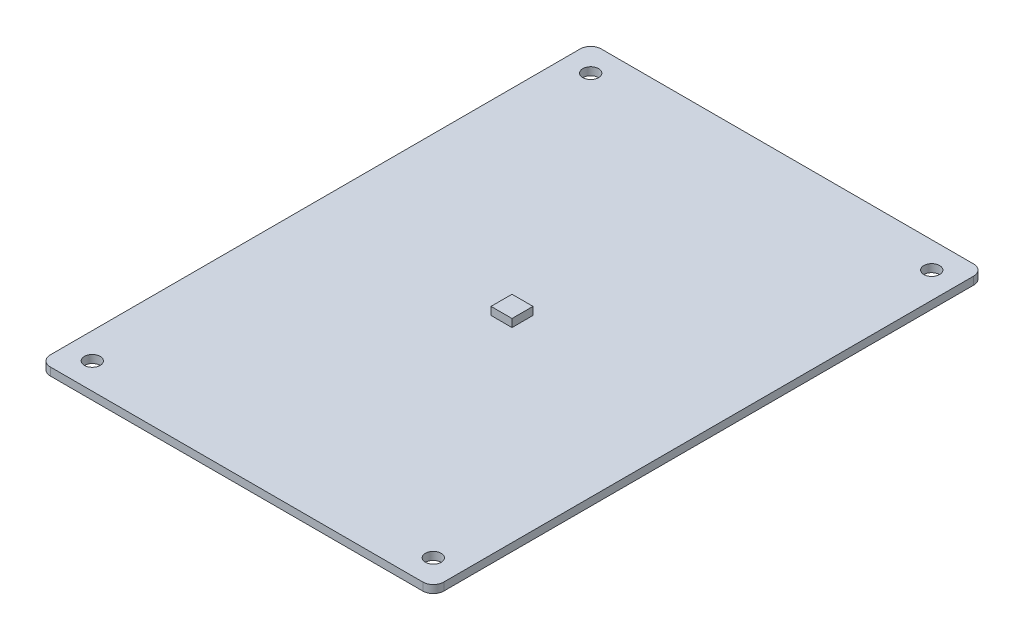
ISO-10303-21;
HEADER;
FILE_DESCRIPTION(('STEP AP214'),'2;1');
FILE_NAME('part.step','',(''),(''),'','','');
FILE_SCHEMA(('AUTOMOTIVE_DESIGN { 1 0 10303 214 1 1 1 1 }'));
ENDSEC;
DATA;
#1=APPLICATION_CONTEXT('core data for automotive mechanical design processes');
#2=APPLICATION_PROTOCOL_DEFINITION('international standard','automotive_design',2000,#1);
#3=PRODUCT_CONTEXT('',#1,'mechanical');
#4=PRODUCT('Part','Part','',(#3));
#5=PRODUCT_RELATED_PRODUCT_CATEGORY('part','',(#4));
#6=PRODUCT_DEFINITION_FORMATION('','',#4);
#7=PRODUCT_DEFINITION_CONTEXT('part definition',#1,'design');
#8=PRODUCT_DEFINITION('design','',#6,#7);
#9=PRODUCT_DEFINITION_SHAPE('','',#8);
#10=(LENGTH_UNIT() NAMED_UNIT(*) SI_UNIT(.MILLI.,.METRE.));
#11=(NAMED_UNIT(*) PLANE_ANGLE_UNIT() SI_UNIT($,.RADIAN.));
#12=(NAMED_UNIT(*) SI_UNIT($,.STERADIAN.) SOLID_ANGLE_UNIT());
#13=UNCERTAINTY_MEASURE_WITH_UNIT(LENGTH_MEASURE(1.E-05),#10,'distance_accuracy_value','');
#14=(GEOMETRIC_REPRESENTATION_CONTEXT(3) GLOBAL_UNCERTAINTY_ASSIGNED_CONTEXT((#13)) GLOBAL_UNIT_ASSIGNED_CONTEXT((#10,
#11,#12)) REPRESENTATION_CONTEXT('',''));
#15=CARTESIAN_POINT('',(0.,0.,0.));
#16=DIRECTION('',(0.,0.,1.));
#17=DIRECTION('',(1.,0.,0.));
#18=AXIS2_PLACEMENT_3D('',#15,#16,#17);
#19=CARTESIAN_POINT('',(41.5141509433962,1.5,20.0400943396226));
#20=DIRECTION('',(0.,1.,0.));
#21=DIRECTION('',(0.,0.,1.));
#22=AXIS2_PLACEMENT_3D('',#19,#20,#21);
#23=PLANE('',#22);
#24=CARTESIAN_POINT('',(-26.4858490566038,1.5,17.0400943396226));
#25=DIRECTION('',(0.,1.,0.));
#26=DIRECTION('',(0.,0.,1.));
#27=AXIS2_PLACEMENT_3D('',#24,#25,#26);
#28=CIRCLE('',#27,1.5);
#29=CARTESIAN_POINT('',(-26.4858490566038,1.5,18.5400943396226));
#30=VERTEX_POINT('',#29);
#31=EDGE_CURVE('E201',#30,#30,#28,.T.);
#32=ORIENTED_EDGE('',*,*,#31,.F.);
#33=EDGE_LOOP('',(#32));
#34=FACE_BOUND('',#33,.T.);
#35=CARTESIAN_POINT('',(38.5141509433962,1.5,-77.9599056603774));
#36=DIRECTION('',(0.,1.,0.));
#37=DIRECTION('',(0.,0.,1.));
#38=AXIS2_PLACEMENT_3D('',#35,#36,#37);
#39=CIRCLE('',#38,1.5);
#40=CARTESIAN_POINT('',(38.5141509433962,1.5,-76.4599056603774));
#41=VERTEX_POINT('',#40);
#42=EDGE_CURVE('E146',#41,#41,#39,.T.);
#43=ORIENTED_EDGE('',*,*,#42,.F.);
#44=EDGE_LOOP('',(#43));
#45=FACE_BOUND('',#44,.T.);
#46=CARTESIAN_POINT('',(41.5141509433962,1.5,20.0400943396226));
#47=DIRECTION('',(0.,1.,0.));
#48=DIRECTION('',(0.,0.,1.));
#49=AXIS2_PLACEMENT_3D('',#46,#47,#48);
#50=CIRCLE('',#49,2.);
#51=CARTESIAN_POINT('',(41.5141509433962,1.5,22.0400943396226));
#52=VERTEX_POINT('',#51);
#53=CARTESIAN_POINT('',(43.5141509433962,1.5,20.0400943396226));
#54=VERTEX_POINT('',#53);
#55=EDGE_CURVE('E158',#52,#54,#50,.T.);
#56=ORIENTED_EDGE('',*,*,#55,.T.);
#57=DIRECTION('',(0.,0.,-1.));
#58=VECTOR('',#57,1.);
#59=CARTESIAN_POINT('',(43.5141509433962,1.5,-80.9599056603774));
#60=LINE('',#59,#58);
#61=CARTESIAN_POINT('',(43.5141509433962,1.5,-80.9599056603774));
#62=VERTEX_POINT('',#61);
#63=EDGE_CURVE('E98',#54,#62,#60,.T.);
#64=ORIENTED_EDGE('',*,*,#63,.T.);
#65=CARTESIAN_POINT('',(41.5141509433962,1.5,-80.9599056603774));
#66=DIRECTION('',(0.,1.,0.));
#67=DIRECTION('',(0.,0.,-1.));
#68=AXIS2_PLACEMENT_3D('',#65,#66,#67);
#69=CIRCLE('',#68,2.);
#70=CARTESIAN_POINT('',(41.5141509433962,1.5,-82.9599056603774));
#71=VERTEX_POINT('',#70);
#72=EDGE_CURVE('E173',#62,#71,#69,.T.);
#73=ORIENTED_EDGE('',*,*,#72,.T.);
#74=DIRECTION('',(-1.,0.,0.));
#75=VECTOR('',#74,1.);
#76=CARTESIAN_POINT('',(-29.4858490566038,1.5,-82.9599056603774));
#77=LINE('',#76,#75);
#78=CARTESIAN_POINT('',(-29.4858490566038,1.5,-82.9599056603774));
#79=VERTEX_POINT('',#78);
#80=EDGE_CURVE('E186',#71,#79,#77,.T.);
#81=ORIENTED_EDGE('',*,*,#80,.T.);
#82=CARTESIAN_POINT('',(-29.4858490566038,1.5,-80.9599056603774));
#83=DIRECTION('',(0.,1.,0.));
#84=DIRECTION('',(0.,0.,1.));
#85=AXIS2_PLACEMENT_3D('',#82,#83,#84);
#86=CIRCLE('',#85,2.);
#87=CARTESIAN_POINT('',(-31.4858490566038,1.5,-80.9599056603774));
#88=VERTEX_POINT('',#87);
#89=EDGE_CURVE('E121',#79,#88,#86,.T.);
#90=ORIENTED_EDGE('',*,*,#89,.T.);
#91=DIRECTION('',(0.,0.,1.));
#92=VECTOR('',#91,1.);
#93=CARTESIAN_POINT('',(-31.4858490566038,1.5,-80.9599056603774));
#94=LINE('',#93,#92);
#95=CARTESIAN_POINT('',(-31.4858490566038,1.5,20.0400943396226));
#96=VERTEX_POINT('',#95);
#97=EDGE_CURVE('E114',#88,#96,#94,.T.);
#98=ORIENTED_EDGE('',*,*,#97,.T.);
#99=CARTESIAN_POINT('',(-29.4858490566038,1.5,20.0400943396226));
#100=DIRECTION('',(0.,1.,0.));
#101=DIRECTION('',(0.,0.,1.));
#102=AXIS2_PLACEMENT_3D('',#99,#100,#101);
#103=CIRCLE('',#102,2.);
#104=CARTESIAN_POINT('',(-29.4858490566038,1.5,22.0400943396226));
#105=VERTEX_POINT('',#104);
#106=EDGE_CURVE('E118',#96,#105,#103,.T.);
#107=ORIENTED_EDGE('',*,*,#106,.T.);
#108=DIRECTION('',(1.,0.,0.));
#109=VECTOR('',#108,1.);
#110=CARTESIAN_POINT('',(-29.4858490566038,1.5,22.0400943396226));
#111=LINE('',#110,#109);
#112=EDGE_CURVE('E57',#105,#52,#111,.T.);
#113=ORIENTED_EDGE('',*,*,#112,.T.);
#114=EDGE_LOOP('',(#56,#64,#73,#81,#90,#98,#107,#113));
#115=FACE_BOUND('',#114,.T.);
#116=CARTESIAN_POINT('',(38.5141509433962,1.5,17.0400943396226));
#117=DIRECTION('',(0.,1.,0.));
#118=DIRECTION('',(0.,0.,1.));
#119=AXIS2_PLACEMENT_3D('',#116,#117,#118);
#120=CIRCLE('',#119,1.5);
#121=CARTESIAN_POINT('',(38.5141509433962,1.5,18.5400943396226));
#122=VERTEX_POINT('',#121);
#123=EDGE_CURVE('E195',#122,#122,#120,.T.);
#124=ORIENTED_EDGE('',*,*,#123,.F.);
#125=EDGE_LOOP('',(#124));
#126=FACE_BOUND('',#125,.T.);
#127=CARTESIAN_POINT('',(-26.4858490566038,1.5,-77.9599056603774));
#128=DIRECTION('',(0.,1.,0.));
#129=DIRECTION('',(0.,0.,1.));
#130=AXIS2_PLACEMENT_3D('',#127,#128,#129);
#131=CIRCLE('',#130,1.5);
#132=CARTESIAN_POINT('',(-26.4858490566038,1.5,-76.4599056603774));
#133=VERTEX_POINT('',#132);
#134=EDGE_CURVE('E207',#133,#133,#131,.T.);
#135=ORIENTED_EDGE('',*,*,#134,.F.);
#136=EDGE_LOOP('',(#135));
#137=FACE_BOUND('',#136,.T.);
#138=DIRECTION('',(-1.,0.,0.));
#139=VECTOR('',#138,1.);
#140=CARTESIAN_POINT('',(4.01415094339619,1.5,-32.4599056603774));
#141=LINE('',#140,#139);
#142=CARTESIAN_POINT('',(8.01415094339619,1.5,-32.4599056603774));
#143=VERTEX_POINT('',#142);
#144=CARTESIAN_POINT('',(4.01415094339619,1.5,-32.4599056603774));
#145=VERTEX_POINT('',#144);
#146=EDGE_CURVE('E231',#143,#145,#141,.T.);
#147=ORIENTED_EDGE('',*,*,#146,.F.);
#148=DIRECTION('',(0.,0.,-1.));
#149=VECTOR('',#148,1.);
#150=CARTESIAN_POINT('',(8.01415094339619,1.5,-28.4599056603774));
#151=LINE('',#150,#149);
#152=CARTESIAN_POINT('',(8.01415094339619,1.5,-28.4599056603774));
#153=VERTEX_POINT('',#152);
#154=EDGE_CURVE('E234',#153,#143,#151,.T.);
#155=ORIENTED_EDGE('',*,*,#154,.F.);
#156=DIRECTION('',(1.,0.,0.));
#157=VECTOR('',#156,1.);
#158=CARTESIAN_POINT('',(4.01415094339619,1.5,-28.4599056603774));
#159=LINE('',#158,#157);
#160=CARTESIAN_POINT('',(4.0141509433962,1.5,-28.4599056603774));
#161=VERTEX_POINT('',#160);
#162=EDGE_CURVE('E226',#161,#153,#159,.T.);
#163=ORIENTED_EDGE('',*,*,#162,.F.);
#164=DIRECTION('',(0.,0.,1.));
#165=VECTOR('',#164,1.);
#166=CARTESIAN_POINT('',(4.01415094339619,1.5,-28.4599056603774));
#167=LINE('',#166,#165);
#168=EDGE_CURVE('E229',#145,#161,#167,.T.);
#169=ORIENTED_EDGE('',*,*,#168,.F.);
#170=EDGE_LOOP('',(#147,#155,#163,#169));
#171=FACE_BOUND('',#170,.T.);
#172=ADVANCED_FACE('F33',(#34,#45,#115,#126,#137,#171),#23,.T.);
#173=CARTESIAN_POINT('',(41.5141509433962,0.,20.0400943396226));
#174=DIRECTION('',(0.,1.,0.));
#175=DIRECTION('',(0.,0.,1.));
#176=AXIS2_PLACEMENT_3D('',#173,#174,#175);
#177=PLANE('',#176);
#178=CARTESIAN_POINT('',(41.5141509433962,0.,20.0400943396226));
#179=DIRECTION('',(0.,1.,0.));
#180=DIRECTION('',(0.,0.,1.));
#181=AXIS2_PLACEMENT_3D('',#178,#179,#180);
#182=CIRCLE('',#181,2.);
#183=CARTESIAN_POINT('',(41.5141509433962,0.,22.0400943396226));
#184=VERTEX_POINT('',#183);
#185=CARTESIAN_POINT('',(43.5141509433962,0.,20.0400943396226));
#186=VERTEX_POINT('',#185);
#187=EDGE_CURVE('E142',#184,#186,#182,.T.);
#188=ORIENTED_EDGE('',*,*,#187,.F.);
#189=DIRECTION('',(1.,0.,0.));
#190=VECTOR('',#189,1.);
#191=CARTESIAN_POINT('',(-29.4858490566038,0.,22.0400943396226));
#192=LINE('',#191,#190);
#193=CARTESIAN_POINT('',(-29.4858490566038,0.,22.0400943396226));
#194=VERTEX_POINT('',#193);
#195=EDGE_CURVE('E90',#194,#184,#192,.T.);
#196=ORIENTED_EDGE('',*,*,#195,.F.);
#197=CARTESIAN_POINT('',(-29.4858490566038,0.,20.0400943396226));
#198=DIRECTION('',(0.,1.,0.));
#199=DIRECTION('',(0.,0.,1.));
#200=AXIS2_PLACEMENT_3D('',#197,#198,#199);
#201=CIRCLE('',#200,2.);
#202=CARTESIAN_POINT('',(-31.4858490566038,0.,20.0400943396226));
#203=VERTEX_POINT('',#202);
#204=EDGE_CURVE('E155',#203,#194,#201,.T.);
#205=ORIENTED_EDGE('',*,*,#204,.F.);
#206=DIRECTION('',(0.,0.,1.));
#207=VECTOR('',#206,1.);
#208=CARTESIAN_POINT('',(-31.4858490566038,0.,-80.9599056603774));
#209=LINE('',#208,#207);
#210=CARTESIAN_POINT('',(-31.4858490566038,0.,-80.9599056603774));
#211=VERTEX_POINT('',#210);
#212=EDGE_CURVE('E130',#211,#203,#209,.T.);
#213=ORIENTED_EDGE('',*,*,#212,.F.);
#214=CARTESIAN_POINT('',(-29.4858490566038,0.,-80.9599056603774));
#215=DIRECTION('',(0.,1.,0.));
#216=DIRECTION('',(0.,0.,1.));
#217=AXIS2_PLACEMENT_3D('',#214,#215,#216);
#218=CIRCLE('',#217,2.);
#219=CARTESIAN_POINT('',(-29.4858490566038,0.,-82.9599056603774));
#220=VERTEX_POINT('',#219);
#221=EDGE_CURVE('E152',#220,#211,#218,.T.);
#222=ORIENTED_EDGE('',*,*,#221,.F.);
#223=DIRECTION('',(-1.,0.,0.));
#224=VECTOR('',#223,1.);
#225=CARTESIAN_POINT('',(-29.4858490566038,0.,-82.9599056603774));
#226=LINE('',#225,#224);
#227=CARTESIAN_POINT('',(41.5141509433962,0.,-82.9599056603774));
#228=VERTEX_POINT('',#227);
#229=EDGE_CURVE('E150',#228,#220,#226,.T.);
#230=ORIENTED_EDGE('',*,*,#229,.F.);
#231=CARTESIAN_POINT('',(41.5141509433962,0.,-80.9599056603774));
#232=DIRECTION('',(0.,1.,0.));
#233=DIRECTION('',(0.,0.,-1.));
#234=AXIS2_PLACEMENT_3D('',#231,#232,#233);
#235=CIRCLE('',#234,2.);
#236=CARTESIAN_POINT('',(43.5141509433962,0.,-80.9599056603774));
#237=VERTEX_POINT('',#236);
#238=EDGE_CURVE('E148',#237,#228,#235,.T.);
#239=ORIENTED_EDGE('',*,*,#238,.F.);
#240=DIRECTION('',(0.,0.,-1.));
#241=VECTOR('',#240,1.);
#242=CARTESIAN_POINT('',(43.5141509433962,0.,-80.9599056603774));
#243=LINE('',#242,#241);
#244=EDGE_CURVE('E145',#186,#237,#243,.T.);
#245=ORIENTED_EDGE('',*,*,#244,.F.);
#246=EDGE_LOOP('',(#188,#196,#205,#213,#222,#230,#239,#245));
#247=FACE_BOUND('',#246,.T.);
#248=CARTESIAN_POINT('',(38.5141509433962,0.,-77.9599056603774));
#249=DIRECTION('',(0.,1.,0.));
#250=DIRECTION('',(0.,0.,1.));
#251=AXIS2_PLACEMENT_3D('',#248,#249,#250);
#252=CIRCLE('',#251,1.5);
#253=CARTESIAN_POINT('',(38.5141509433962,0.,-76.4599056603774));
#254=VERTEX_POINT('',#253);
#255=EDGE_CURVE('E192',#254,#254,#252,.T.);
#256=ORIENTED_EDGE('',*,*,#255,.T.);
#257=EDGE_LOOP('',(#256));
#258=FACE_BOUND('',#257,.T.);
#259=CARTESIAN_POINT('',(38.5141509433962,0.,17.0400943396226));
#260=DIRECTION('',(0.,1.,0.));
#261=DIRECTION('',(0.,0.,1.));
#262=AXIS2_PLACEMENT_3D('',#259,#260,#261);
#263=CIRCLE('',#262,1.5);
#264=CARTESIAN_POINT('',(38.5141509433962,0.,18.5400943396226));
#265=VERTEX_POINT('',#264);
#266=EDGE_CURVE('E198',#265,#265,#263,.T.);
#267=ORIENTED_EDGE('',*,*,#266,.T.);
#268=EDGE_LOOP('',(#267));
#269=FACE_BOUND('',#268,.T.);
#270=CARTESIAN_POINT('',(-26.4858490566038,0.,17.0400943396226));
#271=DIRECTION('',(0.,1.,0.));
#272=DIRECTION('',(0.,0.,1.));
#273=AXIS2_PLACEMENT_3D('',#270,#271,#272);
#274=CIRCLE('',#273,1.5);
#275=CARTESIAN_POINT('',(-26.4858490566038,0.,18.5400943396226));
#276=VERTEX_POINT('',#275);
#277=EDGE_CURVE('E204',#276,#276,#274,.T.);
#278=ORIENTED_EDGE('',*,*,#277,.T.);
#279=EDGE_LOOP('',(#278));
#280=FACE_BOUND('',#279,.T.);
#281=CARTESIAN_POINT('',(-26.4858490566038,0.,-77.9599056603774));
#282=DIRECTION('',(0.,1.,0.));
#283=DIRECTION('',(0.,0.,1.));
#284=AXIS2_PLACEMENT_3D('',#281,#282,#283);
#285=CIRCLE('',#284,1.5);
#286=CARTESIAN_POINT('',(-26.4858490566038,0.,-76.4599056603774));
#287=VERTEX_POINT('',#286);
#288=EDGE_CURVE('E210',#287,#287,#285,.T.);
#289=ORIENTED_EDGE('',*,*,#288,.T.);
#290=EDGE_LOOP('',(#289));
#291=FACE_BOUND('',#290,.T.);
#292=ADVANCED_FACE('F177',(#247,#258,#269,#280,#291),#177,.F.);
#293=CARTESIAN_POINT('',(41.5141509433962,1.5,20.0400943396226));
#294=DIRECTION('',(0.,-1.,0.));
#295=DIRECTION('',(0.,0.,-1.));
#296=AXIS2_PLACEMENT_3D('',#293,#294,#295);
#297=CYLINDRICAL_SURFACE('',#296,2.);
#298=ORIENTED_EDGE('',*,*,#187,.T.);
#299=DIRECTION('',(0.,-1.,0.));
#300=VECTOR('',#299,1.);
#301=CARTESIAN_POINT('',(43.5141509433962,1.5,20.0400943396226));
#302=LINE('',#301,#300);
#303=EDGE_CURVE('E11',#54,#186,#302,.T.);
#304=ORIENTED_EDGE('',*,*,#303,.F.);
#305=ORIENTED_EDGE('',*,*,#55,.F.);
#306=DIRECTION('',(0.,-1.,0.));
#307=VECTOR('',#306,1.);
#308=CARTESIAN_POINT('',(41.5141509433962,1.5,22.0400943396226));
#309=LINE('',#308,#307);
#310=EDGE_CURVE('E138',#52,#184,#309,.T.);
#311=ORIENTED_EDGE('',*,*,#310,.T.);
#312=EDGE_LOOP('',(#298,#304,#305,#311));
#313=FACE_BOUND('',#312,.T.);
#314=ADVANCED_FACE('F35',(#313),#297,.T.);
#315=CARTESIAN_POINT('',(43.5141509433962,1.5,-80.9599056603774));
#316=DIRECTION('',(-1.,0.,0.));
#317=DIRECTION('',(0.,0.,1.));
#318=AXIS2_PLACEMENT_3D('',#315,#316,#317);
#319=PLANE('',#318);
#320=ORIENTED_EDGE('',*,*,#244,.T.);
#321=DIRECTION('',(0.,-1.,0.));
#322=VECTOR('',#321,1.);
#323=CARTESIAN_POINT('',(43.5141509433962,1.5,-80.9599056603774));
#324=LINE('',#323,#322);
#325=EDGE_CURVE('E41',#62,#237,#324,.T.);
#326=ORIENTED_EDGE('',*,*,#325,.F.);
#327=ORIENTED_EDGE('',*,*,#63,.F.);
#328=ORIENTED_EDGE('',*,*,#303,.T.);
#329=EDGE_LOOP('',(#320,#326,#327,#328));
#330=FACE_BOUND('',#329,.T.);
#331=ADVANCED_FACE('F301',(#330),#319,.F.);
#332=CARTESIAN_POINT('',(41.5141509433962,1.5,-80.9599056603774));
#333=DIRECTION('',(0.,-1.,0.));
#334=DIRECTION('',(0.,0.,-1.));
#335=AXIS2_PLACEMENT_3D('',#332,#333,#334);
#336=CYLINDRICAL_SURFACE('',#335,2.);
#337=ORIENTED_EDGE('',*,*,#238,.T.);
#338=DIRECTION('',(0.,-1.,0.));
#339=VECTOR('',#338,1.);
#340=CARTESIAN_POINT('',(41.5141509433962,1.5,-82.9599056603774));
#341=LINE('',#340,#339);
#342=EDGE_CURVE('E165',#71,#228,#341,.T.);
#343=ORIENTED_EDGE('',*,*,#342,.F.);
#344=ORIENTED_EDGE('',*,*,#72,.F.);
#345=ORIENTED_EDGE('',*,*,#325,.T.);
#346=EDGE_LOOP('',(#337,#343,#344,#345));
#347=FACE_BOUND('',#346,.T.);
#348=ADVANCED_FACE('F171',(#347),#336,.T.);
#349=CARTESIAN_POINT('',(-29.4858490566038,1.5,-82.9599056603774));
#350=DIRECTION('',(0.,0.,1.));
#351=DIRECTION('',(1.,0.,0.));
#352=AXIS2_PLACEMENT_3D('',#349,#350,#351);
#353=PLANE('',#352);
#354=ORIENTED_EDGE('',*,*,#229,.T.);
#355=DIRECTION('',(0.,-1.,0.));
#356=VECTOR('',#355,1.);
#357=CARTESIAN_POINT('',(-29.4858490566038,1.5,-82.9599056603774));
#358=LINE('',#357,#356);
#359=EDGE_CURVE('E162',#79,#220,#358,.T.);
#360=ORIENTED_EDGE('',*,*,#359,.F.);
#361=ORIENTED_EDGE('',*,*,#80,.F.);
#362=ORIENTED_EDGE('',*,*,#342,.T.);
#363=EDGE_LOOP('',(#354,#360,#361,#362));
#364=FACE_BOUND('',#363,.T.);
#365=ADVANCED_FACE('F182',(#364),#353,.F.);
#366=CARTESIAN_POINT('',(-29.4858490566038,1.5,-80.9599056603774));
#367=DIRECTION('',(0.,-1.,0.));
#368=DIRECTION('',(0.,0.,-1.));
#369=AXIS2_PLACEMENT_3D('',#366,#367,#368);
#370=CYLINDRICAL_SURFACE('',#369,2.);
#371=ORIENTED_EDGE('',*,*,#221,.T.);
#372=DIRECTION('',(0.,-1.,0.));
#373=VECTOR('',#372,1.);
#374=CARTESIAN_POINT('',(-31.4858490566038,1.5,-80.9599056603774));
#375=LINE('',#374,#373);
#376=EDGE_CURVE('E133',#88,#211,#375,.T.);
#377=ORIENTED_EDGE('',*,*,#376,.F.);
#378=ORIENTED_EDGE('',*,*,#89,.F.);
#379=ORIENTED_EDGE('',*,*,#359,.T.);
#380=EDGE_LOOP('',(#371,#377,#378,#379));
#381=FACE_BOUND('',#380,.T.);
#382=ADVANCED_FACE('F185',(#381),#370,.T.);
#383=CARTESIAN_POINT('',(-31.4858490566038,1.5,-80.9599056603774));
#384=DIRECTION('',(1.,0.,0.));
#385=DIRECTION('',(0.,0.,-1.));
#386=AXIS2_PLACEMENT_3D('',#383,#384,#385);
#387=PLANE('',#386);
#388=ORIENTED_EDGE('',*,*,#212,.T.);
#389=DIRECTION('',(0.,-1.,0.));
#390=VECTOR('',#389,1.);
#391=CARTESIAN_POINT('',(-31.4858490566038,1.5,20.0400943396226));
#392=LINE('',#391,#390);
#393=EDGE_CURVE('E127',#96,#203,#392,.T.);
#394=ORIENTED_EDGE('',*,*,#393,.F.);
#395=ORIENTED_EDGE('',*,*,#97,.F.);
#396=ORIENTED_EDGE('',*,*,#376,.T.);
#397=EDGE_LOOP('',(#388,#394,#395,#396));
#398=FACE_BOUND('',#397,.T.);
#399=ADVANCED_FACE('F128',(#398),#387,.F.);
#400=CARTESIAN_POINT('',(-29.4858490566038,1.5,20.0400943396226));
#401=DIRECTION('',(0.,-1.,0.));
#402=DIRECTION('',(0.,0.,-1.));
#403=AXIS2_PLACEMENT_3D('',#400,#401,#402);
#404=CYLINDRICAL_SURFACE('',#403,2.);
#405=ORIENTED_EDGE('',*,*,#204,.T.);
#406=DIRECTION('',(0.,-1.,0.));
#407=VECTOR('',#406,1.);
#408=CARTESIAN_POINT('',(-29.4858490566038,1.5,22.0400943396226));
#409=LINE('',#408,#407);
#410=EDGE_CURVE('E134',#105,#194,#409,.T.);
#411=ORIENTED_EDGE('',*,*,#410,.F.);
#412=ORIENTED_EDGE('',*,*,#106,.F.);
#413=ORIENTED_EDGE('',*,*,#393,.T.);
#414=EDGE_LOOP('',(#405,#411,#412,#413));
#415=FACE_BOUND('',#414,.T.);
#416=ADVANCED_FACE('F136',(#415),#404,.T.);
#417=CARTESIAN_POINT('',(-29.4858490566038,1.5,22.0400943396226));
#418=DIRECTION('',(0.,0.,-1.));
#419=DIRECTION('',(-1.,0.,0.));
#420=AXIS2_PLACEMENT_3D('',#417,#418,#419);
#421=PLANE('',#420);
#422=ORIENTED_EDGE('',*,*,#195,.T.);
#423=ORIENTED_EDGE('',*,*,#310,.F.);
#424=ORIENTED_EDGE('',*,*,#112,.F.);
#425=ORIENTED_EDGE('',*,*,#410,.T.);
#426=EDGE_LOOP('',(#422,#423,#424,#425));
#427=FACE_BOUND('',#426,.T.);
#428=ADVANCED_FACE('F289',(#427),#421,.F.);
#429=CARTESIAN_POINT('',(38.5141509433962,1.5,-77.9599056603774));
#430=DIRECTION('',(0.,-1.,0.));
#431=DIRECTION('',(0.,0.,-1.));
#432=AXIS2_PLACEMENT_3D('',#429,#430,#431);
#433=CYLINDRICAL_SURFACE('',#432,1.5);
#434=ORIENTED_EDGE('',*,*,#42,.T.);
#435=EDGE_LOOP('',(#434));
#436=FACE_BOUND('',#435,.T.);
#437=ORIENTED_EDGE('',*,*,#255,.F.);
#438=EDGE_LOOP('',(#437));
#439=FACE_BOUND('',#438,.T.);
#440=ADVANCED_FACE('F286',(#436,#439),#433,.F.);
#441=CARTESIAN_POINT('',(38.5141509433962,1.5,17.0400943396226));
#442=DIRECTION('',(0.,-1.,0.));
#443=DIRECTION('',(0.,0.,-1.));
#444=AXIS2_PLACEMENT_3D('',#441,#442,#443);
#445=CYLINDRICAL_SURFACE('',#444,1.5);
#446=ORIENTED_EDGE('',*,*,#123,.T.);
#447=EDGE_LOOP('',(#446));
#448=FACE_BOUND('',#447,.T.);
#449=ORIENTED_EDGE('',*,*,#266,.F.);
#450=EDGE_LOOP('',(#449));
#451=FACE_BOUND('',#450,.T.);
#452=ADVANCED_FACE('F361',(#448,#451),#445,.F.);
#453=CARTESIAN_POINT('',(-26.4858490566038,1.5,17.0400943396226));
#454=DIRECTION('',(0.,-1.,0.));
#455=DIRECTION('',(0.,0.,-1.));
#456=AXIS2_PLACEMENT_3D('',#453,#454,#455);
#457=CYLINDRICAL_SURFACE('',#456,1.5);
#458=ORIENTED_EDGE('',*,*,#31,.T.);
#459=EDGE_LOOP('',(#458));
#460=FACE_BOUND('',#459,.T.);
#461=ORIENTED_EDGE('',*,*,#277,.F.);
#462=EDGE_LOOP('',(#461));
#463=FACE_BOUND('',#462,.T.);
#464=ADVANCED_FACE('F369',(#460,#463),#457,.F.);
#465=CARTESIAN_POINT('',(-26.4858490566038,1.5,-77.9599056603774));
#466=DIRECTION('',(0.,-1.,0.));
#467=DIRECTION('',(0.,0.,-1.));
#468=AXIS2_PLACEMENT_3D('',#465,#466,#467);
#469=CYLINDRICAL_SURFACE('',#468,1.5);
#470=ORIENTED_EDGE('',*,*,#134,.T.);
#471=EDGE_LOOP('',(#470));
#472=FACE_BOUND('',#471,.T.);
#473=ORIENTED_EDGE('',*,*,#288,.F.);
#474=EDGE_LOOP('',(#473));
#475=FACE_BOUND('',#474,.T.);
#476=ADVANCED_FACE('F377',(#472,#475),#469,.F.);
#477=CARTESIAN_POINT('',(8.01415094339619,3.,-28.4599056603774));
#478=DIRECTION('',(-1.,0.,0.));
#479=DIRECTION('',(0.,0.,1.));
#480=AXIS2_PLACEMENT_3D('',#477,#478,#479);
#481=PLANE('',#480);
#482=ORIENTED_EDGE('',*,*,#154,.T.);
#483=DIRECTION('',(0.,-1.,0.));
#484=VECTOR('',#483,1.);
#485=CARTESIAN_POINT('',(8.01415094339619,3.,-32.4599056603774));
#486=LINE('',#485,#484);
#487=CARTESIAN_POINT('',(8.01415094339619,3.,-32.4599056603774));
#488=VERTEX_POINT('',#487);
#489=EDGE_CURVE('E213',#488,#143,#486,.T.);
#490=ORIENTED_EDGE('',*,*,#489,.F.);
#491=DIRECTION('',(0.,0.,-1.));
#492=VECTOR('',#491,1.);
#493=CARTESIAN_POINT('',(8.01415094339619,3.,-28.4599056603774));
#494=LINE('',#493,#492);
#495=CARTESIAN_POINT('',(8.01415094339619,3.,-28.4599056603774));
#496=VERTEX_POINT('',#495);
#497=EDGE_CURVE('E228',#496,#488,#494,.T.);
#498=ORIENTED_EDGE('',*,*,#497,.F.);
#499=DIRECTION('',(0.,-1.,0.));
#500=VECTOR('',#499,1.);
#501=CARTESIAN_POINT('',(8.01415094339619,3.,-28.4599056603774));
#502=LINE('',#501,#500);
#503=EDGE_CURVE('E222',#496,#153,#502,.T.);
#504=ORIENTED_EDGE('',*,*,#503,.T.);
#505=EDGE_LOOP('',(#482,#490,#498,#504));
#506=FACE_BOUND('',#505,.T.);
#507=ADVANCED_FACE('F257',(#506),#481,.F.);
#508=CARTESIAN_POINT('',(4.01415094339619,3.,-32.4599056603774));
#509=DIRECTION('',(0.,0.,1.));
#510=DIRECTION('',(1.,0.,0.));
#511=AXIS2_PLACEMENT_3D('',#508,#509,#510);
#512=PLANE('',#511);
#513=ORIENTED_EDGE('',*,*,#146,.T.);
#514=DIRECTION('',(0.,-1.,0.));
#515=VECTOR('',#514,1.);
#516=CARTESIAN_POINT('',(4.01415094339619,3.,-32.4599056603774));
#517=LINE('',#516,#515);
#518=CARTESIAN_POINT('',(4.01415094339619,3.,-32.4599056603774));
#519=VERTEX_POINT('',#518);
#520=EDGE_CURVE('E218',#519,#145,#517,.T.);
#521=ORIENTED_EDGE('',*,*,#520,.F.);
#522=DIRECTION('',(-1.,0.,0.));
#523=VECTOR('',#522,1.);
#524=CARTESIAN_POINT('',(4.01415094339619,3.,-32.4599056603774));
#525=LINE('',#524,#523);
#526=EDGE_CURVE('E242',#488,#519,#525,.T.);
#527=ORIENTED_EDGE('',*,*,#526,.F.);
#528=ORIENTED_EDGE('',*,*,#489,.T.);
#529=EDGE_LOOP('',(#513,#521,#527,#528));
#530=FACE_BOUND('',#529,.T.);
#531=ADVANCED_FACE('F262',(#530),#512,.F.);
#532=CARTESIAN_POINT('',(4.01415094339619,3.,-28.4599056603774));
#533=DIRECTION('',(1.,0.,0.));
#534=DIRECTION('',(0.,0.,-1.));
#535=AXIS2_PLACEMENT_3D('',#532,#533,#534);
#536=PLANE('',#535);
#537=ORIENTED_EDGE('',*,*,#168,.T.);
#538=DIRECTION('',(0.,-1.,0.));
#539=VECTOR('',#538,1.);
#540=CARTESIAN_POINT('',(4.01415094339619,3.,-28.4599056603774));
#541=LINE('',#540,#539);
#542=CARTESIAN_POINT('',(4.01415094339619,3.,-28.4599056603774));
#543=VERTEX_POINT('',#542);
#544=EDGE_CURVE('E48',#543,#161,#541,.T.);
#545=ORIENTED_EDGE('',*,*,#544,.F.);
#546=DIRECTION('',(0.,0.,1.));
#547=VECTOR('',#546,1.);
#548=CARTESIAN_POINT('',(4.01415094339619,3.,-28.4599056603774));
#549=LINE('',#548,#547);
#550=EDGE_CURVE('E239',#519,#543,#549,.T.);
#551=ORIENTED_EDGE('',*,*,#550,.F.);
#552=ORIENTED_EDGE('',*,*,#520,.T.);
#553=EDGE_LOOP('',(#537,#545,#551,#552));
#554=FACE_BOUND('',#553,.T.);
#555=ADVANCED_FACE('F271',(#554),#536,.F.);
#556=CARTESIAN_POINT('',(4.01415094339619,3.,-28.4599056603774));
#557=DIRECTION('',(0.,0.,-1.));
#558=DIRECTION('',(-1.,0.,0.));
#559=AXIS2_PLACEMENT_3D('',#556,#557,#558);
#560=PLANE('',#559);
#561=ORIENTED_EDGE('',*,*,#162,.T.);
#562=ORIENTED_EDGE('',*,*,#503,.F.);
#563=DIRECTION('',(1.,0.,0.));
#564=VECTOR('',#563,1.);
#565=CARTESIAN_POINT('',(4.01415094339619,3.,-28.4599056603774));
#566=LINE('',#565,#564);
#567=EDGE_CURVE('E225',#543,#496,#566,.T.);
#568=ORIENTED_EDGE('',*,*,#567,.F.);
#569=ORIENTED_EDGE('',*,*,#544,.T.);
#570=EDGE_LOOP('',(#561,#562,#568,#569));
#571=FACE_BOUND('',#570,.T.);
#572=ADVANCED_FACE('F274',(#571),#560,.F.);
#573=CARTESIAN_POINT('',(0.,3.,0.));
#574=DIRECTION('',(0.,-1.,0.));
#575=DIRECTION('',(0.,0.,-1.));
#576=AXIS2_PLACEMENT_3D('',#573,#574,#575);
#577=PLANE('',#576);
#578=ORIENTED_EDGE('',*,*,#497,.T.);
#579=ORIENTED_EDGE('',*,*,#526,.T.);
#580=ORIENTED_EDGE('',*,*,#550,.T.);
#581=ORIENTED_EDGE('',*,*,#567,.T.);
#582=EDGE_LOOP('',(#578,#579,#580,#581));
#583=FACE_BOUND('',#582,.T.);
#584=ADVANCED_FACE('F250',(#583),#577,.F.);
#585=CLOSED_SHELL('',(#172,#292,#314,#331,#348,#365,#382,#399,#416,#428,#440,#452,#464,#476,
#507,#531,#555,#572,#584));
#586=MANIFOLD_SOLID_BREP('B2',#585);
#587=ADVANCED_BREP_SHAPE_REPRESENTATION('',(#18,#586),#14);
#588=SHAPE_DEFINITION_REPRESENTATION(#9,#587);
ENDSEC;
END-ISO-10303-21;
